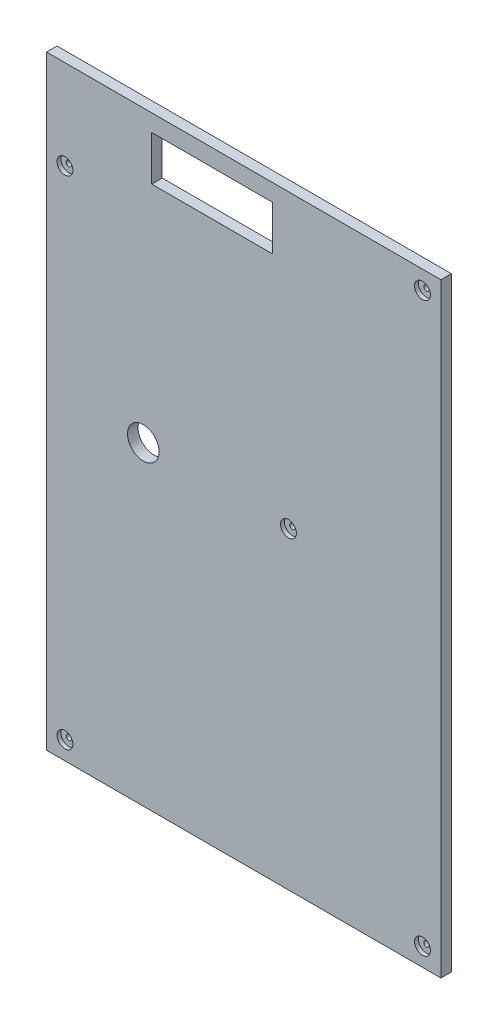
ISO-10303-21;
HEADER;
FILE_DESCRIPTION(('STEP AP214'),'2;1');
FILE_NAME('part.step','',(''),(''),'','','');
FILE_SCHEMA(('AUTOMOTIVE_DESIGN { 1 0 10303 214 1 1 1 1 }'));
ENDSEC;
DATA;
#1=APPLICATION_CONTEXT('core data for automotive mechanical design processes');
#2=APPLICATION_PROTOCOL_DEFINITION('international standard','automotive_design',2000,#1);
#3=PRODUCT_CONTEXT('',#1,'mechanical');
#4=PRODUCT('Part','Part','',(#3));
#5=PRODUCT_RELATED_PRODUCT_CATEGORY('part','',(#4));
#6=PRODUCT_DEFINITION_FORMATION('','',#4);
#7=PRODUCT_DEFINITION_CONTEXT('part definition',#1,'design');
#8=PRODUCT_DEFINITION('design','',#6,#7);
#9=PRODUCT_DEFINITION_SHAPE('','',#8);
#10=(LENGTH_UNIT() NAMED_UNIT(*) SI_UNIT(.MILLI.,.METRE.));
#11=(NAMED_UNIT(*) PLANE_ANGLE_UNIT() SI_UNIT($,.RADIAN.));
#12=(NAMED_UNIT(*) SI_UNIT($,.STERADIAN.) SOLID_ANGLE_UNIT());
#13=UNCERTAINTY_MEASURE_WITH_UNIT(LENGTH_MEASURE(1.E-05),#10,'distance_accuracy_value','');
#14=(GEOMETRIC_REPRESENTATION_CONTEXT(3) GLOBAL_UNCERTAINTY_ASSIGNED_CONTEXT((#13)) GLOBAL_UNIT_ASSIGNED_CONTEXT((#10,
#11,#12)) REPRESENTATION_CONTEXT('',''));
#15=CARTESIAN_POINT('',(0.,0.,0.));
#16=DIRECTION('',(0.,0.,1.));
#17=DIRECTION('',(1.,0.,0.));
#18=AXIS2_PLACEMENT_3D('',#15,#16,#17);
#19=CARTESIAN_POINT('',(0.,0.,4.));
#20=DIRECTION('',(0.,0.,-1.));
#21=DIRECTION('',(-1.,0.,0.));
#22=AXIS2_PLACEMENT_3D('',#19,#20,#21);
#23=PLANE('',#22);
#24=CARTESIAN_POINT('',(-38.2022973922176,4.69238405691286,4.));
#25=DIRECTION('',(0.,0.,1.));
#26=DIRECTION('',(1.,0.,0.));
#27=AXIS2_PLACEMENT_3D('',#24,#25,#26);
#28=CIRCLE('',#27,6.);
#29=CARTESIAN_POINT('',(-32.2022973922176,4.69238405691286,4.));
#30=VERTEX_POINT('',#29);
#31=EDGE_CURVE('E287',#30,#30,#28,.T.);
#32=ORIENTED_EDGE('',*,*,#31,.F.);
#33=EDGE_LOOP('',(#32));
#34=FACE_BOUND('',#33,.T.);
#35=DIRECTION('',(0.,1.,0.));
#36=VECTOR('',#35,1.);
#37=CARTESIAN_POINT('',(75.,-115.,4.));
#38=LINE('',#37,#36);
#39=CARTESIAN_POINT('',(75.,-115.,4.));
#40=VERTEX_POINT('',#39);
#41=CARTESIAN_POINT('',(75.,115.,4.));
#42=VERTEX_POINT('',#41);
#43=EDGE_CURVE('E182',#40,#42,#38,.T.);
#44=ORIENTED_EDGE('',*,*,#43,.T.);
#45=DIRECTION('',(-1.,0.,0.));
#46=VECTOR('',#45,1.);
#47=CARTESIAN_POINT('',(-75.,115.,4.));
#48=LINE('',#47,#46);
#49=CARTESIAN_POINT('',(-75.,115.,4.));
#50=VERTEX_POINT('',#49);
#51=EDGE_CURVE('E185',#42,#50,#48,.T.);
#52=ORIENTED_EDGE('',*,*,#51,.T.);
#53=DIRECTION('',(0.,-1.,0.));
#54=VECTOR('',#53,1.);
#55=CARTESIAN_POINT('',(-75.,-115.,4.));
#56=LINE('',#55,#54);
#57=CARTESIAN_POINT('',(-75.,-115.,4.));
#58=VERTEX_POINT('',#57);
#59=EDGE_CURVE('E188',#50,#58,#56,.T.);
#60=ORIENTED_EDGE('',*,*,#59,.T.);
#61=DIRECTION('',(1.,0.,0.));
#62=VECTOR('',#61,1.);
#63=CARTESIAN_POINT('',(-75.,-115.,4.));
#64=LINE('',#63,#62);
#65=EDGE_CURVE('E190',#58,#40,#64,.T.);
#66=ORIENTED_EDGE('',*,*,#65,.T.);
#67=EDGE_LOOP('',(#44,#52,#60,#66));
#68=FACE_BOUND('',#67,.T.);
#69=CARTESIAN_POINT('',(-68.,81.,4.));
#70=DIRECTION('',(0.,0.,1.));
#71=DIRECTION('',(1.,0.,0.));
#72=AXIS2_PLACEMENT_3D('',#69,#70,#71);
#73=CIRCLE('',#72,3.02500000000001);
#74=CARTESIAN_POINT('',(-64.975,81.,4.));
#75=VERTEX_POINT('',#74);
#76=EDGE_CURVE('E151',#75,#75,#73,.T.);
#77=ORIENTED_EDGE('',*,*,#76,.F.);
#78=EDGE_LOOP('',(#77));
#79=FACE_BOUND('',#78,.T.);
#80=CARTESIAN_POINT('',(17.,4.,4.));
#81=DIRECTION('',(0.,0.,1.));
#82=DIRECTION('',(1.,0.,0.));
#83=AXIS2_PLACEMENT_3D('',#80,#81,#82);
#84=CIRCLE('',#83,3.02499999999999);
#85=CARTESIAN_POINT('',(20.025,4.,4.));
#86=VERTEX_POINT('',#85);
#87=EDGE_CURVE('E135',#86,#86,#84,.T.);
#88=ORIENTED_EDGE('',*,*,#87,.F.);
#89=EDGE_LOOP('',(#88));
#90=FACE_BOUND('',#89,.T.);
#91=CARTESIAN_POINT('',(68.,-108.,4.));
#92=DIRECTION('',(0.,0.,1.));
#93=DIRECTION('',(1.,0.,0.));
#94=AXIS2_PLACEMENT_3D('',#91,#92,#93);
#95=CIRCLE('',#94,3.02499999999999);
#96=CARTESIAN_POINT('',(71.0249999999999,-108.,4.));
#97=VERTEX_POINT('',#96);
#98=EDGE_CURVE('E140',#97,#97,#95,.T.);
#99=ORIENTED_EDGE('',*,*,#98,.F.);
#100=EDGE_LOOP('',(#99));
#101=FACE_BOUND('',#100,.T.);
#102=CARTESIAN_POINT('',(-68.,-108.,4.));
#103=DIRECTION('',(0.,0.,1.));
#104=DIRECTION('',(1.,0.,0.));
#105=AXIS2_PLACEMENT_3D('',#102,#103,#104);
#106=CIRCLE('',#105,3.02500000000001);
#107=CARTESIAN_POINT('',(-64.975,-108.,4.));
#108=VERTEX_POINT('',#107);
#109=EDGE_CURVE('E139',#108,#108,#106,.T.);
#110=ORIENTED_EDGE('',*,*,#109,.F.);
#111=EDGE_LOOP('',(#110));
#112=FACE_BOUND('',#111,.T.);
#113=CARTESIAN_POINT('',(68.,108.,4.));
#114=DIRECTION('',(0.,0.,1.));
#115=DIRECTION('',(1.,0.,0.));
#116=AXIS2_PLACEMENT_3D('',#113,#114,#115);
#117=CIRCLE('',#116,3.02499999999999);
#118=CARTESIAN_POINT('',(71.025,108.,4.));
#119=VERTEX_POINT('',#118);
#120=EDGE_CURVE('E152',#119,#119,#117,.T.);
#121=ORIENTED_EDGE('',*,*,#120,.F.);
#122=EDGE_LOOP('',(#121));
#123=FACE_BOUND('',#122,.T.);
#124=DIRECTION('',(0.,-1.,0.));
#125=VECTOR('',#124,1.);
#126=CARTESIAN_POINT('',(-35.,0.,4.));
#127=LINE('',#126,#125);
#128=CARTESIAN_POINT('',(-35.,108.5,4.));
#129=VERTEX_POINT('',#128);
#130=CARTESIAN_POINT('',(-35.,91.5,4.));
#131=VERTEX_POINT('',#130);
#132=EDGE_CURVE('E103',#129,#131,#127,.T.);
#133=ORIENTED_EDGE('',*,*,#132,.F.);
#134=DIRECTION('',(-1.,0.,0.));
#135=VECTOR('',#134,1.);
#136=CARTESIAN_POINT('',(0.,108.5,4.));
#137=LINE('',#136,#135);
#138=CARTESIAN_POINT('',(11.,108.5,4.));
#139=VERTEX_POINT('',#138);
#140=EDGE_CURVE('E106',#139,#129,#137,.T.);
#141=ORIENTED_EDGE('',*,*,#140,.F.);
#142=DIRECTION('',(0.,1.,0.));
#143=VECTOR('',#142,1.);
#144=CARTESIAN_POINT('',(11.,0.,4.));
#145=LINE('',#144,#143);
#146=CARTESIAN_POINT('',(11.,91.5,4.));
#147=VERTEX_POINT('',#146);
#148=EDGE_CURVE('E130',#147,#139,#145,.T.);
#149=ORIENTED_EDGE('',*,*,#148,.F.);
#150=DIRECTION('',(1.,0.,0.));
#151=VECTOR('',#150,1.);
#152=CARTESIAN_POINT('',(0.,91.5,4.));
#153=LINE('',#152,#151);
#154=EDGE_CURVE('E132',#131,#147,#153,.T.);
#155=ORIENTED_EDGE('',*,*,#154,.F.);
#156=EDGE_LOOP('',(#133,#141,#149,#155));
#157=FACE_BOUND('',#156,.T.);
#158=ADVANCED_FACE('F33',(#34,#68,#79,#90,#101,#112,#123,#157),#23,.F.);
#159=CARTESIAN_POINT('',(0.,0.,0.));
#160=DIRECTION('',(0.,0.,-1.));
#161=DIRECTION('',(-1.,0.,0.));
#162=AXIS2_PLACEMENT_3D('',#159,#160,#161);
#163=PLANE('',#162);
#164=CARTESIAN_POINT('',(-38.2022973922176,4.69238405691286,0.));
#165=DIRECTION('',(0.,0.,-1.));
#166=DIRECTION('',(-1.,0.,0.));
#167=AXIS2_PLACEMENT_3D('',#164,#165,#166);
#168=CIRCLE('',#167,6.);
#169=CARTESIAN_POINT('',(-44.2022973922176,4.69238405691286,0.));
#170=VERTEX_POINT('',#169);
#171=EDGE_CURVE('E289',#170,#170,#168,.F.);
#172=ORIENTED_EDGE('',*,*,#171,.T.);
#173=EDGE_LOOP('',(#172));
#174=FACE_BOUND('',#173,.T.);
#175=CARTESIAN_POINT('',(68.,108.,0.));
#176=DIRECTION('',(0.,0.,-1.));
#177=DIRECTION('',(-1.,0.,0.));
#178=AXIS2_PLACEMENT_3D('',#175,#176,#177);
#179=CIRCLE('',#178,1.02499999999998);
#180=CARTESIAN_POINT('',(66.975,108.,0.));
#181=VERTEX_POINT('',#180);
#182=EDGE_CURVE('E166',#181,#181,#179,.T.);
#183=ORIENTED_EDGE('',*,*,#182,.F.);
#184=EDGE_LOOP('',(#183));
#185=FACE_BOUND('',#184,.T.);
#186=CARTESIAN_POINT('',(-68.,81.,0.));
#187=DIRECTION('',(0.,0.,-1.));
#188=DIRECTION('',(-1.,0.,0.));
#189=AXIS2_PLACEMENT_3D('',#186,#187,#188);
#190=CIRCLE('',#189,1.02499999999998);
#191=CARTESIAN_POINT('',(-69.025,81.,0.));
#192=VERTEX_POINT('',#191);
#193=EDGE_CURVE('E169',#192,#192,#190,.T.);
#194=ORIENTED_EDGE('',*,*,#193,.F.);
#195=EDGE_LOOP('',(#194));
#196=FACE_BOUND('',#195,.T.);
#197=CARTESIAN_POINT('',(68.,-108.,0.));
#198=DIRECTION('',(0.,0.,-1.));
#199=DIRECTION('',(-1.,0.,0.));
#200=AXIS2_PLACEMENT_3D('',#197,#198,#199);
#201=CIRCLE('',#200,1.02499999999998);
#202=CARTESIAN_POINT('',(66.975,-108.,0.));
#203=VERTEX_POINT('',#202);
#204=EDGE_CURVE('E172',#203,#203,#201,.T.);
#205=ORIENTED_EDGE('',*,*,#204,.F.);
#206=EDGE_LOOP('',(#205));
#207=FACE_BOUND('',#206,.T.);
#208=CARTESIAN_POINT('',(-68.,-108.,0.));
#209=DIRECTION('',(0.,0.,-1.));
#210=DIRECTION('',(-1.,0.,0.));
#211=AXIS2_PLACEMENT_3D('',#208,#209,#210);
#212=CIRCLE('',#211,1.02499999999998);
#213=CARTESIAN_POINT('',(-69.025,-108.,0.));
#214=VERTEX_POINT('',#213);
#215=EDGE_CURVE('E175',#214,#214,#212,.T.);
#216=ORIENTED_EDGE('',*,*,#215,.F.);
#217=EDGE_LOOP('',(#216));
#218=FACE_BOUND('',#217,.T.);
#219=CARTESIAN_POINT('',(17.,4.,0.));
#220=DIRECTION('',(0.,0.,-1.));
#221=DIRECTION('',(-1.,0.,0.));
#222=AXIS2_PLACEMENT_3D('',#219,#220,#221);
#223=CIRCLE('',#222,1.02499999999999);
#224=CARTESIAN_POINT('',(15.975,4.,0.));
#225=VERTEX_POINT('',#224);
#226=EDGE_CURVE('E178',#225,#225,#223,.T.);
#227=ORIENTED_EDGE('',*,*,#226,.F.);
#228=EDGE_LOOP('',(#227));
#229=FACE_BOUND('',#228,.T.);
#230=DIRECTION('',(0.,1.,0.));
#231=VECTOR('',#230,1.);
#232=CARTESIAN_POINT('',(75.,-115.,0.));
#233=LINE('',#232,#231);
#234=CARTESIAN_POINT('',(75.,-115.,0.));
#235=VERTEX_POINT('',#234);
#236=CARTESIAN_POINT('',(75.,115.,0.));
#237=VERTEX_POINT('',#236);
#238=EDGE_CURVE('E181',#235,#237,#233,.T.);
#239=ORIENTED_EDGE('',*,*,#238,.F.);
#240=DIRECTION('',(1.,0.,0.));
#241=VECTOR('',#240,1.);
#242=CARTESIAN_POINT('',(-75.,-115.,0.));
#243=LINE('',#242,#241);
#244=CARTESIAN_POINT('',(-75.,-115.,0.));
#245=VERTEX_POINT('',#244);
#246=EDGE_CURVE('E186',#245,#235,#243,.T.);
#247=ORIENTED_EDGE('',*,*,#246,.F.);
#248=DIRECTION('',(0.,-1.,0.));
#249=VECTOR('',#248,1.);
#250=CARTESIAN_POINT('',(-75.,-115.,0.));
#251=LINE('',#250,#249);
#252=CARTESIAN_POINT('',(-75.,115.,0.));
#253=VERTEX_POINT('',#252);
#254=EDGE_CURVE('E197',#253,#245,#251,.T.);
#255=ORIENTED_EDGE('',*,*,#254,.F.);
#256=DIRECTION('',(-1.,0.,0.));
#257=VECTOR('',#256,1.);
#258=CARTESIAN_POINT('',(-75.,115.,0.));
#259=LINE('',#258,#257);
#260=EDGE_CURVE('E195',#237,#253,#259,.T.);
#261=ORIENTED_EDGE('',*,*,#260,.F.);
#262=EDGE_LOOP('',(#239,#247,#255,#261));
#263=FACE_BOUND('',#262,.T.);
#264=DIRECTION('',(-1.,0.,0.));
#265=VECTOR('',#264,1.);
#266=CARTESIAN_POINT('',(-35.,108.5,0.));
#267=LINE('',#266,#265);
#268=CARTESIAN_POINT('',(11.,108.5,0.));
#269=VERTEX_POINT('',#268);
#270=CARTESIAN_POINT('',(-35.,108.5,0.));
#271=VERTEX_POINT('',#270);
#272=EDGE_CURVE('E120',#269,#271,#267,.T.);
#273=ORIENTED_EDGE('',*,*,#272,.T.);
#274=DIRECTION('',(0.,-1.,0.));
#275=VECTOR('',#274,1.);
#276=CARTESIAN_POINT('',(-35.,108.5,0.));
#277=LINE('',#276,#275);
#278=CARTESIAN_POINT('',(-35.,91.5,0.));
#279=VERTEX_POINT('',#278);
#280=EDGE_CURVE('E58',#271,#279,#277,.T.);
#281=ORIENTED_EDGE('',*,*,#280,.T.);
#282=DIRECTION('',(1.,0.,0.));
#283=VECTOR('',#282,1.);
#284=CARTESIAN_POINT('',(-35.,91.5,0.));
#285=LINE('',#284,#283);
#286=CARTESIAN_POINT('',(11.,91.5,0.));
#287=VERTEX_POINT('',#286);
#288=EDGE_CURVE('E110',#279,#287,#285,.T.);
#289=ORIENTED_EDGE('',*,*,#288,.T.);
#290=DIRECTION('',(0.,1.,0.));
#291=VECTOR('',#290,1.);
#292=CARTESIAN_POINT('',(11.,108.5,0.));
#293=LINE('',#292,#291);
#294=EDGE_CURVE('E122',#287,#269,#293,.T.);
#295=ORIENTED_EDGE('',*,*,#294,.T.);
#296=EDGE_LOOP('',(#273,#281,#289,#295));
#297=FACE_BOUND('',#296,.T.);
#298=ADVANCED_FACE('F119',(#174,#185,#196,#207,#218,#229,#263,#297),#163,.T.);
#299=CARTESIAN_POINT('',(17.,4.,0.));
#300=DIRECTION('',(0.,0.,-1.));
#301=DIRECTION('',(-1.,0.,0.));
#302=AXIS2_PLACEMENT_3D('',#299,#300,#301);
#303=CYLINDRICAL_SURFACE('',#302,1.02499999999999);
#304=ORIENTED_EDGE('',*,*,#226,.T.);
#305=EDGE_LOOP('',(#304));
#306=FACE_BOUND('',#305,.T.);
#307=CARTESIAN_POINT('',(17.,4.,2.5));
#308=DIRECTION('',(0.,0.,1.));
#309=DIRECTION('',(1.,0.,0.));
#310=AXIS2_PLACEMENT_3D('',#307,#308,#309);
#311=CIRCLE('',#310,1.02499999999999);
#312=CARTESIAN_POINT('',(18.025,4.,2.5));
#313=VERTEX_POINT('',#312);
#314=EDGE_CURVE('E37',#313,#313,#311,.F.);
#315=ORIENTED_EDGE('',*,*,#314,.F.);
#316=EDGE_LOOP('',(#315));
#317=FACE_BOUND('',#316,.T.);
#318=ADVANCED_FACE('F223',(#306,#317),#303,.F.);
#319=CARTESIAN_POINT('',(-68.,-108.,0.));
#320=DIRECTION('',(0.,0.,-1.));
#321=DIRECTION('',(-1.,0.,0.));
#322=AXIS2_PLACEMENT_3D('',#319,#320,#321);
#323=CYLINDRICAL_SURFACE('',#322,1.02499999999999);
#324=ORIENTED_EDGE('',*,*,#215,.T.);
#325=EDGE_LOOP('',(#324));
#326=FACE_BOUND('',#325,.T.);
#327=CARTESIAN_POINT('',(-68.,-108.,2.5));
#328=DIRECTION('',(0.,0.,1.));
#329=DIRECTION('',(1.,0.,0.));
#330=AXIS2_PLACEMENT_3D('',#327,#328,#329);
#331=CIRCLE('',#330,1.02499999999999);
#332=CARTESIAN_POINT('',(-66.975,-108.,2.5));
#333=VERTEX_POINT('',#332);
#334=EDGE_CURVE('E214',#333,#333,#331,.F.);
#335=ORIENTED_EDGE('',*,*,#334,.F.);
#336=EDGE_LOOP('',(#335));
#337=FACE_BOUND('',#336,.T.);
#338=ADVANCED_FACE('F225',(#326,#337),#323,.F.);
#339=CARTESIAN_POINT('',(68.,-108.,0.));
#340=DIRECTION('',(0.,0.,-1.));
#341=DIRECTION('',(-1.,0.,0.));
#342=AXIS2_PLACEMENT_3D('',#339,#340,#341);
#343=CYLINDRICAL_SURFACE('',#342,1.02499999999999);
#344=ORIENTED_EDGE('',*,*,#204,.T.);
#345=EDGE_LOOP('',(#344));
#346=FACE_BOUND('',#345,.T.);
#347=CARTESIAN_POINT('',(68.,-108.,2.5));
#348=DIRECTION('',(0.,0.,1.));
#349=DIRECTION('',(1.,0.,0.));
#350=AXIS2_PLACEMENT_3D('',#347,#348,#349);
#351=CIRCLE('',#350,1.02499999999999);
#352=CARTESIAN_POINT('',(69.0249999999999,-108.,2.5));
#353=VERTEX_POINT('',#352);
#354=EDGE_CURVE('E212',#353,#353,#351,.F.);
#355=ORIENTED_EDGE('',*,*,#354,.F.);
#356=EDGE_LOOP('',(#355));
#357=FACE_BOUND('',#356,.T.);
#358=ADVANCED_FACE('F232',(#346,#357),#343,.F.);
#359=CARTESIAN_POINT('',(-68.,81.,0.));
#360=DIRECTION('',(0.,0.,-1.));
#361=DIRECTION('',(-1.,0.,0.));
#362=AXIS2_PLACEMENT_3D('',#359,#360,#361);
#363=CYLINDRICAL_SURFACE('',#362,1.02499999999999);
#364=ORIENTED_EDGE('',*,*,#193,.T.);
#365=EDGE_LOOP('',(#364));
#366=FACE_BOUND('',#365,.T.);
#367=CARTESIAN_POINT('',(-68.,81.,2.5));
#368=DIRECTION('',(0.,0.,1.));
#369=DIRECTION('',(1.,0.,0.));
#370=AXIS2_PLACEMENT_3D('',#367,#368,#369);
#371=CIRCLE('',#370,1.02499999999999);
#372=CARTESIAN_POINT('',(-66.975,81.,2.5));
#373=VERTEX_POINT('',#372);
#374=EDGE_CURVE('E209',#373,#373,#371,.F.);
#375=ORIENTED_EDGE('',*,*,#374,.F.);
#376=EDGE_LOOP('',(#375));
#377=FACE_BOUND('',#376,.T.);
#378=ADVANCED_FACE('F352',(#366,#377),#363,.F.);
#379=CARTESIAN_POINT('',(68.,108.,0.));
#380=DIRECTION('',(0.,0.,-1.));
#381=DIRECTION('',(-1.,0.,0.));
#382=AXIS2_PLACEMENT_3D('',#379,#380,#381);
#383=CYLINDRICAL_SURFACE('',#382,1.02499999999999);
#384=ORIENTED_EDGE('',*,*,#182,.T.);
#385=EDGE_LOOP('',(#384));
#386=FACE_BOUND('',#385,.T.);
#387=CARTESIAN_POINT('',(68.,108.,2.5));
#388=DIRECTION('',(0.,0.,1.));
#389=DIRECTION('',(1.,0.,0.));
#390=AXIS2_PLACEMENT_3D('',#387,#388,#389);
#391=CIRCLE('',#390,1.02499999999999);
#392=CARTESIAN_POINT('',(69.025,108.,2.5));
#393=VERTEX_POINT('',#392);
#394=EDGE_CURVE('E163',#393,#393,#391,.F.);
#395=ORIENTED_EDGE('',*,*,#394,.F.);
#396=EDGE_LOOP('',(#395));
#397=FACE_BOUND('',#396,.T.);
#398=ADVANCED_FACE('F259',(#386,#397),#383,.F.);
#399=CARTESIAN_POINT('',(75.,-115.,4.));
#400=DIRECTION('',(-1.,0.,0.));
#401=DIRECTION('',(0.,0.,1.));
#402=AXIS2_PLACEMENT_3D('',#399,#400,#401);
#403=PLANE('',#402);
#404=ORIENTED_EDGE('',*,*,#238,.T.);
#405=DIRECTION('',(0.,0.,-1.));
#406=VECTOR('',#405,1.);
#407=CARTESIAN_POINT('',(75.,115.,4.));
#408=LINE('',#407,#406);
#409=EDGE_CURVE('E11',#42,#237,#408,.T.);
#410=ORIENTED_EDGE('',*,*,#409,.F.);
#411=ORIENTED_EDGE('',*,*,#43,.F.);
#412=DIRECTION('',(0.,0.,-1.));
#413=VECTOR('',#412,1.);
#414=CARTESIAN_POINT('',(75.,-115.,4.));
#415=LINE('',#414,#413);
#416=EDGE_CURVE('E192',#40,#235,#415,.T.);
#417=ORIENTED_EDGE('',*,*,#416,.T.);
#418=EDGE_LOOP('',(#404,#410,#411,#417));
#419=FACE_BOUND('',#418,.T.);
#420=ADVANCED_FACE('F35',(#419),#403,.F.);
#421=CARTESIAN_POINT('',(-75.,115.,4.));
#422=DIRECTION('',(0.,-1.,0.));
#423=DIRECTION('',(0.,0.,-1.));
#424=AXIS2_PLACEMENT_3D('',#421,#422,#423);
#425=PLANE('',#424);
#426=ORIENTED_EDGE('',*,*,#260,.T.);
#427=DIRECTION('',(0.,0.,-1.));
#428=VECTOR('',#427,1.);
#429=CARTESIAN_POINT('',(-75.,115.,4.));
#430=LINE('',#429,#428);
#431=EDGE_CURVE('E42',#50,#253,#430,.T.);
#432=ORIENTED_EDGE('',*,*,#431,.F.);
#433=ORIENTED_EDGE('',*,*,#51,.F.);
#434=ORIENTED_EDGE('',*,*,#409,.T.);
#435=EDGE_LOOP('',(#426,#432,#433,#434));
#436=FACE_BOUND('',#435,.T.);
#437=ADVANCED_FACE('F252',(#436),#425,.F.);
#438=CARTESIAN_POINT('',(-75.,-115.,4.));
#439=DIRECTION('',(1.,0.,0.));
#440=DIRECTION('',(0.,0.,-1.));
#441=AXIS2_PLACEMENT_3D('',#438,#439,#440);
#442=PLANE('',#441);
#443=ORIENTED_EDGE('',*,*,#254,.T.);
#444=DIRECTION('',(0.,0.,-1.));
#445=VECTOR('',#444,1.);
#446=CARTESIAN_POINT('',(-75.,-115.,4.));
#447=LINE('',#446,#445);
#448=EDGE_CURVE('E202',#58,#245,#447,.T.);
#449=ORIENTED_EDGE('',*,*,#448,.F.);
#450=ORIENTED_EDGE('',*,*,#59,.F.);
#451=ORIENTED_EDGE('',*,*,#431,.T.);
#452=EDGE_LOOP('',(#443,#449,#450,#451));
#453=FACE_BOUND('',#452,.T.);
#454=ADVANCED_FACE('F249',(#453),#442,.F.);
#455=CARTESIAN_POINT('',(-75.,-115.,4.));
#456=DIRECTION('',(0.,1.,0.));
#457=DIRECTION('',(0.,0.,1.));
#458=AXIS2_PLACEMENT_3D('',#455,#456,#457);
#459=PLANE('',#458);
#460=ORIENTED_EDGE('',*,*,#246,.T.);
#461=ORIENTED_EDGE('',*,*,#416,.F.);
#462=ORIENTED_EDGE('',*,*,#65,.F.);
#463=ORIENTED_EDGE('',*,*,#448,.T.);
#464=EDGE_LOOP('',(#460,#461,#462,#463));
#465=FACE_BOUND('',#464,.T.);
#466=ADVANCED_FACE('F245',(#465),#459,.F.);
#467=CARTESIAN_POINT('',(68.,108.,2.5));
#468=DIRECTION('',(0.,0.,1.));
#469=DIRECTION('',(1.,0.,0.));
#470=AXIS2_PLACEMENT_3D('',#467,#468,#469);
#471=PLANE('',#470);
#472=CARTESIAN_POINT('',(68.,108.,2.5));
#473=DIRECTION('',(0.,0.,1.));
#474=DIRECTION('',(1.,0.,0.));
#475=AXIS2_PLACEMENT_3D('',#472,#473,#474);
#476=CIRCLE('',#475,3.02499999999999);
#477=CARTESIAN_POINT('',(71.025,108.,2.5));
#478=VERTEX_POINT('',#477);
#479=EDGE_CURVE('E148',#478,#478,#476,.T.);
#480=ORIENTED_EDGE('',*,*,#479,.T.);
#481=EDGE_LOOP('',(#480));
#482=FACE_BOUND('',#481,.T.);
#483=ORIENTED_EDGE('',*,*,#394,.T.);
#484=EDGE_LOOP('',(#483));
#485=FACE_BOUND('',#484,.T.);
#486=ADVANCED_FACE('F248',(#482,#485),#471,.T.);
#487=CARTESIAN_POINT('',(68.,108.,2.5));
#488=DIRECTION('',(0.,0.,1.));
#489=DIRECTION('',(1.,0.,0.));
#490=AXIS2_PLACEMENT_3D('',#487,#488,#489);
#491=CYLINDRICAL_SURFACE('',#490,3.02499999999999);
#492=ORIENTED_EDGE('',*,*,#479,.F.);
#493=EDGE_LOOP('',(#492));
#494=FACE_BOUND('',#493,.T.);
#495=ORIENTED_EDGE('',*,*,#120,.T.);
#496=EDGE_LOOP('',(#495));
#497=FACE_BOUND('',#496,.T.);
#498=ADVANCED_FACE('F332',(#494,#497),#491,.F.);
#499=CARTESIAN_POINT('',(-68.,81.,2.5));
#500=DIRECTION('',(0.,0.,1.));
#501=DIRECTION('',(1.,0.,0.));
#502=AXIS2_PLACEMENT_3D('',#499,#500,#501);
#503=PLANE('',#502);
#504=CARTESIAN_POINT('',(-68.,81.,2.5));
#505=DIRECTION('',(0.,0.,1.));
#506=DIRECTION('',(1.,0.,0.));
#507=AXIS2_PLACEMENT_3D('',#504,#505,#506);
#508=CIRCLE('',#507,3.02500000000001);
#509=CARTESIAN_POINT('',(-64.975,81.,2.5));
#510=VERTEX_POINT('',#509);
#511=EDGE_CURVE('E160',#510,#510,#508,.T.);
#512=ORIENTED_EDGE('',*,*,#511,.T.);
#513=EDGE_LOOP('',(#512));
#514=FACE_BOUND('',#513,.T.);
#515=ORIENTED_EDGE('',*,*,#374,.T.);
#516=EDGE_LOOP('',(#515));
#517=FACE_BOUND('',#516,.T.);
#518=ADVANCED_FACE('F336',(#514,#517),#503,.T.);
#519=CARTESIAN_POINT('',(-68.,81.,2.5));
#520=DIRECTION('',(0.,0.,1.));
#521=DIRECTION('',(1.,0.,0.));
#522=AXIS2_PLACEMENT_3D('',#519,#520,#521);
#523=CYLINDRICAL_SURFACE('',#522,3.02500000000001);
#524=ORIENTED_EDGE('',*,*,#511,.F.);
#525=EDGE_LOOP('',(#524));
#526=FACE_BOUND('',#525,.T.);
#527=ORIENTED_EDGE('',*,*,#76,.T.);
#528=EDGE_LOOP('',(#527));
#529=FACE_BOUND('',#528,.T.);
#530=ADVANCED_FACE('F317',(#526,#529),#523,.F.);
#531=CARTESIAN_POINT('',(68.,-108.,2.5));
#532=DIRECTION('',(0.,0.,1.));
#533=DIRECTION('',(1.,0.,0.));
#534=AXIS2_PLACEMENT_3D('',#531,#532,#533);
#535=PLANE('',#534);
#536=CARTESIAN_POINT('',(68.,-108.,2.5));
#537=DIRECTION('',(0.,0.,1.));
#538=DIRECTION('',(1.,0.,0.));
#539=AXIS2_PLACEMENT_3D('',#536,#537,#538);
#540=CIRCLE('',#539,3.02499999999999);
#541=CARTESIAN_POINT('',(71.0249999999999,-108.,2.5));
#542=VERTEX_POINT('',#541);
#543=EDGE_CURVE('E136',#542,#542,#540,.T.);
#544=ORIENTED_EDGE('',*,*,#543,.T.);
#545=EDGE_LOOP('',(#544));
#546=FACE_BOUND('',#545,.T.);
#547=ORIENTED_EDGE('',*,*,#354,.T.);
#548=EDGE_LOOP('',(#547));
#549=FACE_BOUND('',#548,.T.);
#550=ADVANCED_FACE('F313',(#546,#549),#535,.T.);
#551=CARTESIAN_POINT('',(68.,-108.,2.5));
#552=DIRECTION('',(0.,0.,1.));
#553=DIRECTION('',(1.,0.,0.));
#554=AXIS2_PLACEMENT_3D('',#551,#552,#553);
#555=CYLINDRICAL_SURFACE('',#554,3.02499999999999);
#556=ORIENTED_EDGE('',*,*,#543,.F.);
#557=EDGE_LOOP('',(#556));
#558=FACE_BOUND('',#557,.T.);
#559=ORIENTED_EDGE('',*,*,#98,.T.);
#560=EDGE_LOOP('',(#559));
#561=FACE_BOUND('',#560,.T.);
#562=ADVANCED_FACE('F316',(#558,#561),#555,.F.);
#563=CARTESIAN_POINT('',(-68.,-108.,2.5));
#564=DIRECTION('',(0.,0.,1.));
#565=DIRECTION('',(1.,0.,0.));
#566=AXIS2_PLACEMENT_3D('',#563,#564,#565);
#567=PLANE('',#566);
#568=CARTESIAN_POINT('',(-68.,-108.,2.5));
#569=DIRECTION('',(0.,0.,1.));
#570=DIRECTION('',(1.,0.,0.));
#571=AXIS2_PLACEMENT_3D('',#568,#569,#570);
#572=CIRCLE('',#571,3.02500000000001);
#573=CARTESIAN_POINT('',(-64.975,-108.,2.5));
#574=VERTEX_POINT('',#573);
#575=EDGE_CURVE('E155',#574,#574,#572,.T.);
#576=ORIENTED_EDGE('',*,*,#575,.T.);
#577=EDGE_LOOP('',(#576));
#578=FACE_BOUND('',#577,.T.);
#579=ORIENTED_EDGE('',*,*,#334,.T.);
#580=EDGE_LOOP('',(#579));
#581=FACE_BOUND('',#580,.T.);
#582=ADVANCED_FACE('F321',(#578,#581),#567,.T.);
#583=CARTESIAN_POINT('',(-68.,-108.,2.5));
#584=DIRECTION('',(0.,0.,1.));
#585=DIRECTION('',(1.,0.,0.));
#586=AXIS2_PLACEMENT_3D('',#583,#584,#585);
#587=CYLINDRICAL_SURFACE('',#586,3.02500000000001);
#588=ORIENTED_EDGE('',*,*,#575,.F.);
#589=EDGE_LOOP('',(#588));
#590=FACE_BOUND('',#589,.T.);
#591=ORIENTED_EDGE('',*,*,#109,.T.);
#592=EDGE_LOOP('',(#591));
#593=FACE_BOUND('',#592,.T.);
#594=ADVANCED_FACE('F325',(#590,#593),#587,.F.);
#595=CARTESIAN_POINT('',(17.,4.,2.5));
#596=DIRECTION('',(0.,0.,1.));
#597=DIRECTION('',(1.,0.,0.));
#598=AXIS2_PLACEMENT_3D('',#595,#596,#597);
#599=PLANE('',#598);
#600=CARTESIAN_POINT('',(17.,4.,2.5));
#601=DIRECTION('',(0.,0.,1.));
#602=DIRECTION('',(1.,0.,0.));
#603=AXIS2_PLACEMENT_3D('',#600,#601,#602);
#604=CIRCLE('',#603,3.02499999999999);
#605=CARTESIAN_POINT('',(20.025,4.,2.5));
#606=VERTEX_POINT('',#605);
#607=EDGE_CURVE('E143',#606,#606,#604,.T.);
#608=ORIENTED_EDGE('',*,*,#607,.T.);
#609=EDGE_LOOP('',(#608));
#610=FACE_BOUND('',#609,.T.);
#611=ORIENTED_EDGE('',*,*,#314,.T.);
#612=EDGE_LOOP('',(#611));
#613=FACE_BOUND('',#612,.T.);
#614=ADVANCED_FACE('F221',(#610,#613),#599,.T.);
#615=CARTESIAN_POINT('',(17.,4.,2.5));
#616=DIRECTION('',(0.,0.,1.));
#617=DIRECTION('',(1.,0.,0.));
#618=AXIS2_PLACEMENT_3D('',#615,#616,#617);
#619=CYLINDRICAL_SURFACE('',#618,3.02499999999999);
#620=ORIENTED_EDGE('',*,*,#607,.F.);
#621=EDGE_LOOP('',(#620));
#622=FACE_BOUND('',#621,.T.);
#623=ORIENTED_EDGE('',*,*,#87,.T.);
#624=EDGE_LOOP('',(#623));
#625=FACE_BOUND('',#624,.T.);
#626=ADVANCED_FACE('F312',(#622,#625),#619,.F.);
#627=CARTESIAN_POINT('',(-35.,108.5,4.000012));
#628=DIRECTION('',(1.,0.,0.));
#629=DIRECTION('',(0.,0.,-1.));
#630=AXIS2_PLACEMENT_3D('',#627,#628,#629);
#631=PLANE('',#630);
#632=ORIENTED_EDGE('',*,*,#132,.T.);
#633=DIRECTION('',(0.,0.,-1.));
#634=VECTOR('',#633,1.);
#635=CARTESIAN_POINT('',(-35.,91.5,4.000012));
#636=LINE('',#635,#634);
#637=EDGE_CURVE('E99',#131,#279,#636,.T.);
#638=ORIENTED_EDGE('',*,*,#637,.T.);
#639=ORIENTED_EDGE('',*,*,#280,.F.);
#640=DIRECTION('',(0.,0.,-1.));
#641=VECTOR('',#640,1.);
#642=CARTESIAN_POINT('',(-35.,108.5,4.000012));
#643=LINE('',#642,#641);
#644=EDGE_CURVE('E116',#129,#271,#643,.T.);
#645=ORIENTED_EDGE('',*,*,#644,.F.);
#646=EDGE_LOOP('',(#632,#638,#639,#645));
#647=FACE_BOUND('',#646,.T.);
#648=ADVANCED_FACE('F101',(#647),#631,.T.);
#649=CARTESIAN_POINT('',(-35.,91.5,4.000012));
#650=DIRECTION('',(0.,1.,0.));
#651=DIRECTION('',(0.,0.,1.));
#652=AXIS2_PLACEMENT_3D('',#649,#650,#651);
#653=PLANE('',#652);
#654=ORIENTED_EDGE('',*,*,#154,.T.);
#655=DIRECTION('',(0.,0.,-1.));
#656=VECTOR('',#655,1.);
#657=CARTESIAN_POINT('',(11.,91.5,4.000012));
#658=LINE('',#657,#656);
#659=EDGE_CURVE('E107',#147,#287,#658,.T.);
#660=ORIENTED_EDGE('',*,*,#659,.T.);
#661=ORIENTED_EDGE('',*,*,#288,.F.);
#662=ORIENTED_EDGE('',*,*,#637,.F.);
#663=EDGE_LOOP('',(#654,#660,#661,#662));
#664=FACE_BOUND('',#663,.T.);
#665=ADVANCED_FACE('F111',(#664),#653,.T.);
#666=CARTESIAN_POINT('',(11.,108.5,4.000012));
#667=DIRECTION('',(-1.,0.,0.));
#668=DIRECTION('',(0.,0.,1.));
#669=AXIS2_PLACEMENT_3D('',#666,#667,#668);
#670=PLANE('',#669);
#671=ORIENTED_EDGE('',*,*,#148,.T.);
#672=DIRECTION('',(0.,0.,-1.));
#673=VECTOR('',#672,1.);
#674=CARTESIAN_POINT('',(11.,108.5,4.000012));
#675=LINE('',#674,#673);
#676=EDGE_CURVE('E50',#139,#269,#675,.T.);
#677=ORIENTED_EDGE('',*,*,#676,.T.);
#678=ORIENTED_EDGE('',*,*,#294,.F.);
#679=ORIENTED_EDGE('',*,*,#659,.F.);
#680=EDGE_LOOP('',(#671,#677,#678,#679));
#681=FACE_BOUND('',#680,.T.);
#682=ADVANCED_FACE('F286',(#681),#670,.T.);
#683=CARTESIAN_POINT('',(-35.,108.5,4.000012));
#684=DIRECTION('',(0.,-1.,0.));
#685=DIRECTION('',(0.,0.,-1.));
#686=AXIS2_PLACEMENT_3D('',#683,#684,#685);
#687=PLANE('',#686);
#688=ORIENTED_EDGE('',*,*,#140,.T.);
#689=ORIENTED_EDGE('',*,*,#644,.T.);
#690=ORIENTED_EDGE('',*,*,#272,.F.);
#691=ORIENTED_EDGE('',*,*,#676,.F.);
#692=EDGE_LOOP('',(#688,#689,#690,#691));
#693=FACE_BOUND('',#692,.T.);
#694=ADVANCED_FACE('F299',(#693),#687,.T.);
#695=CARTESIAN_POINT('',(-38.2022973922176,4.69238405691286,-0.001000000000001));
#696=DIRECTION('',(0.,0.,1.));
#697=DIRECTION('',(1.,0.,0.));
#698=AXIS2_PLACEMENT_3D('',#695,#696,#697);
#699=CYLINDRICAL_SURFACE('',#698,6.);
#700=ORIENTED_EDGE('',*,*,#171,.F.);
#701=EDGE_LOOP('',(#700));
#702=FACE_BOUND('',#701,.T.);
#703=ORIENTED_EDGE('',*,*,#31,.T.);
#704=EDGE_LOOP('',(#703));
#705=FACE_BOUND('',#704,.T.);
#706=ADVANCED_FACE('F296',(#702,#705),#699,.F.);
#707=CLOSED_SHELL('',(#158,#298,#318,#338,#358,#378,#398,#420,#437,#454,#466,#486,#498,#518,
#530,#550,#562,#582,#594,#614,#626,#648,#665,#682,#694,#706));
#708=MANIFOLD_SOLID_BREP('B2',#707);
#709=ADVANCED_BREP_SHAPE_REPRESENTATION('',(#18,#708),#14);
#710=SHAPE_DEFINITION_REPRESENTATION(#9,#709);
ENDSEC;
END-ISO-10303-21;
